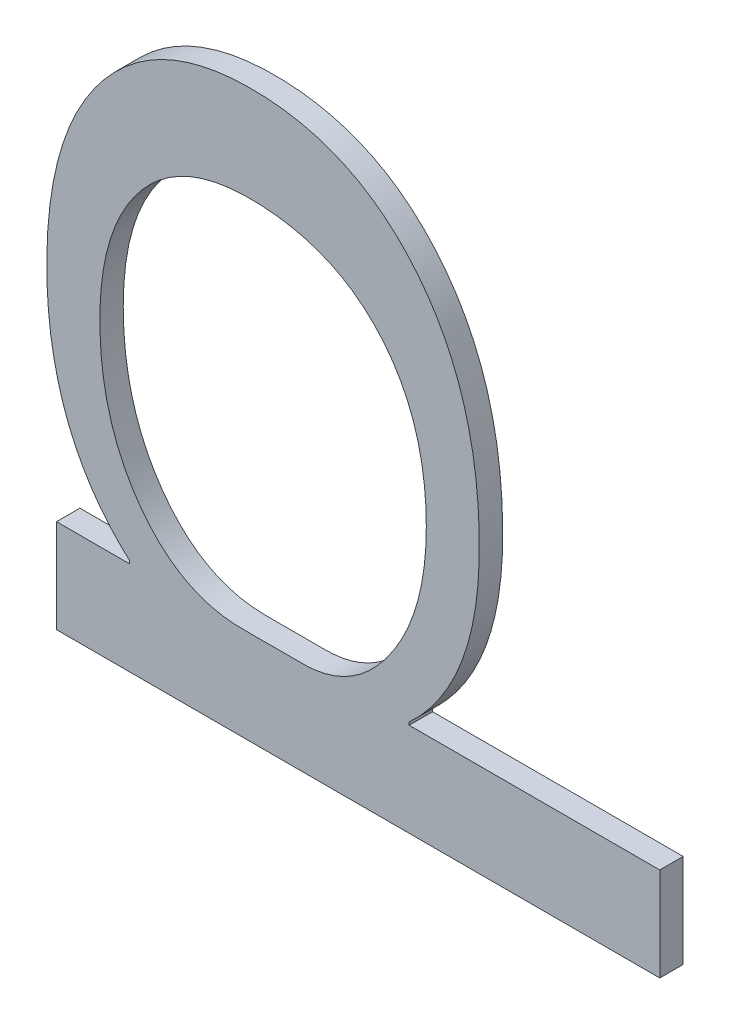
ISO-10303-21;
HEADER;
FILE_DESCRIPTION(('STEP AP214'),'2;1');
FILE_NAME('part.step','',(''),(''),'','','');
FILE_SCHEMA(('AUTOMOTIVE_DESIGN { 1 0 10303 214 1 1 1 1 }'));
ENDSEC;
DATA;
#1=APPLICATION_CONTEXT('core data for automotive mechanical design processes');
#2=APPLICATION_PROTOCOL_DEFINITION('international standard','automotive_design',2000,#1);
#3=PRODUCT_CONTEXT('',#1,'mechanical');
#4=PRODUCT('Part','Part','',(#3));
#5=PRODUCT_RELATED_PRODUCT_CATEGORY('part','',(#4));
#6=PRODUCT_DEFINITION_FORMATION('','',#4);
#7=PRODUCT_DEFINITION_CONTEXT('part definition',#1,'design');
#8=PRODUCT_DEFINITION('design','',#6,#7);
#9=PRODUCT_DEFINITION_SHAPE('','',#8);
#10=(LENGTH_UNIT() NAMED_UNIT(*) SI_UNIT(.MILLI.,.METRE.));
#11=(NAMED_UNIT(*) PLANE_ANGLE_UNIT() SI_UNIT($,.RADIAN.));
#12=(NAMED_UNIT(*) SI_UNIT($,.STERADIAN.) SOLID_ANGLE_UNIT());
#13=UNCERTAINTY_MEASURE_WITH_UNIT(LENGTH_MEASURE(1.E-05),#10,'distance_accuracy_value','');
#14=(GEOMETRIC_REPRESENTATION_CONTEXT(3) GLOBAL_UNCERTAINTY_ASSIGNED_CONTEXT((#13)) GLOBAL_UNIT_ASSIGNED_CONTEXT((#10,
#11,#12)) REPRESENTATION_CONTEXT('',''));
#15=CARTESIAN_POINT('',(0.,0.,0.));
#16=DIRECTION('',(0.,0.,1.));
#17=DIRECTION('',(1.,0.,0.));
#18=AXIS2_PLACEMENT_3D('',#15,#16,#17);
#19=CARTESIAN_POINT('',(-8.95983005625009,-22.7704584365744,333.160489148867));
#20=DIRECTION('',(0.,0.,1.));
#21=DIRECTION('',(1.,0.,0.));
#22=AXIS2_PLACEMENT_3D('',#19,#20,#21);
#23=PLANE('',#22);
#24=DIRECTION('',(1.,0.,0.));
#25=VECTOR('',#24,1.);
#26=CARTESIAN_POINT('',(2.66453525910038E-13,-70.4596635464495,333.160489148867));
#27=LINE('',#26,#25);
#28=CARTESIAN_POINT('',(-7.19032697632218,-70.4596635464495,333.160489148867));
#29=VERTEX_POINT('',#28);
#30=CARTESIAN_POINT('',(-3.97696685012026,-70.4596635464495,333.160489148867));
#31=VERTEX_POINT('',#30);
#32=EDGE_CURVE('E222',#29,#31,#27,.T.);
#33=ORIENTED_EDGE('',*,*,#32,.T.);
#34=DIRECTION('',(0.,-1.,0.));
#35=VECTOR('',#34,1.);
#36=CARTESIAN_POINT('',(-3.97696685012026,-50.9500000001419,333.160489148867));
#37=LINE('',#36,#35);
#38=CARTESIAN_POINT('',(-3.97696685012026,-71.6592860674831,333.160489148867));
#39=VERTEX_POINT('',#38);
#40=EDGE_CURVE('E55',#31,#39,#37,.T.);
#41=ORIENTED_EDGE('',*,*,#40,.T.);
#42=DIRECTION('',(-1.,0.,0.));
#43=VECTOR('',#42,1.);
#44=CARTESIAN_POINT('',(2.66453525910038E-13,-71.6592860674831,333.160489148867));
#45=LINE('',#44,#43);
#46=CARTESIAN_POINT('',(-11.7110601493991,-71.6592860674831,333.160489148867));
#47=VERTEX_POINT('',#46);
#48=EDGE_CURVE('E241',#39,#47,#45,.T.);
#49=ORIENTED_EDGE('',*,*,#48,.T.);
#50=DIRECTION('',(0.,1.,0.));
#51=VECTOR('',#50,1.);
#52=CARTESIAN_POINT('',(-11.7110601493991,-50.9500000001419,333.160489148867));
#53=LINE('',#52,#51);
#54=CARTESIAN_POINT('',(-11.7110601493991,-70.4596635464495,333.160489148867));
#55=VERTEX_POINT('',#54);
#56=EDGE_CURVE('E110',#47,#55,#53,.T.);
#57=ORIENTED_EDGE('',*,*,#56,.T.);
#58=DIRECTION('',(1.,0.,0.));
#59=VECTOR('',#58,1.);
#60=CARTESIAN_POINT('',(2.66453525910038E-13,-70.4596635464495,333.160489148867));
#61=LINE('',#60,#59);
#62=CARTESIAN_POINT('',(-10.7724333465145,-70.4596635464495,333.160489148867));
#63=VERTEX_POINT('',#62);
#64=EDGE_CURVE('E183',#55,#63,#61,.T.);
#65=ORIENTED_EDGE('',*,*,#64,.T.);
#66=DIRECTION('',(0.,1.,0.));
#67=VECTOR('',#66,1.);
#68=CARTESIAN_POINT('',(-10.7724333465145,-50.9500000001419,333.160489148867));
#69=LINE('',#68,#67);
#70=CARTESIAN_POINT('',(-10.7724333465145,-70.4237467045024,333.160489148867));
#71=VERTEX_POINT('',#70);
#72=EDGE_CURVE('E153',#63,#71,#69,.T.);
#73=ORIENTED_EDGE('',*,*,#72,.T.);
#74=CARTESIAN_POINT('',(-10.7724333465145,-70.4237467045024,333.160489148867));
#75=CARTESIAN_POINT('',(-11.4811923609376,-69.7963992920262,333.160489148867));
#76=CARTESIAN_POINT('',(-11.8355718681491,-68.8793225007764,333.160489148867));
#77=CARTESIAN_POINT('',(-11.8355718681491,-66.6620563116414,333.160489148867));
#78=CARTESIAN_POINT('',(-11.6001172669569,-65.8647020166082,333.160489148867));
#79=CARTESIAN_POINT('',(-10.6582974796157,-64.6962080161361,333.160489148867));
#80=CARTESIAN_POINT('',(-10.0205741217549,-64.4040834817653,333.160489148867));
#81=CARTESIAN_POINT('',(-8.33487700637026,-64.4040845553665,333.160489148867));
#82=CARTESIAN_POINT('',(-7.62691581837719,-64.7309279588011,333.160489148867));
#83=CARTESIAN_POINT('',(-6.55739215658717,-66.0383003027596,333.160489148867));
#84=CARTESIAN_POINT('',(-6.29001147151449,-66.9230522168573,333.160489148867));
#85=CARTESIAN_POINT('',(-6.29001147151449,-69.0732734472908,333.160489148867));
#86=CARTESIAN_POINT('',(-6.59011688920624,-69.8682329759204,333.160489148867));
#87=CARTESIAN_POINT('',(-7.19032697632218,-70.4237467045024,333.160489148867));
#88=(BOUNDED_CURVE() B_SPLINE_CURVE(3,(#74,#75,#76,#77,#78,#79,#80,#81,#82,#83,#84,#85,#86,#87),
.UNSPECIFIED.,.F.,.F.) B_SPLINE_CURVE_WITH_KNOTS((4,2,2,2,2,2,4),(0.,0.186607926762102,
0.342855021081848,0.49910207330936,0.670229816207461,0.841357743121363,1.),
.UNSPECIFIED.) CURVE() GEOMETRIC_REPRESENTATION_ITEM() RATIONAL_B_SPLINE_CURVE((1.,1.,1.,1.,1.,
1.,1.,1.,1.,1.,1.,1.,1.,1.)) REPRESENTATION_ITEM(''));
#89=CARTESIAN_POINT('',(-7.19032697632218,-70.4237467045024,333.160489148867));
#90=VERTEX_POINT('',#89);
#91=EDGE_CURVE('E11',#71,#90,#88,.T.);
#92=ORIENTED_EDGE('',*,*,#91,.T.);
#93=DIRECTION('',(0.,-1.,0.));
#94=VECTOR('',#93,1.);
#95=CARTESIAN_POINT('',(-7.19032697632218,-50.9500000001419,333.160489148867));
#96=LINE('',#95,#94);
#97=EDGE_CURVE('E152',#90,#29,#96,.T.);
#98=ORIENTED_EDGE('',*,*,#97,.T.);
#99=EDGE_LOOP('',(#33,#41,#49,#57,#65,#73,#92,#98));
#100=FACE_BOUND('',#99,.T.);
#101=CARTESIAN_POINT('',(-6.97003701237988,-68.1466189864366,333.160489148867));
#102=CARTESIAN_POINT('',(-6.97003701237988,-67.3660264138048,333.160489148867));
#103=CARTESIAN_POINT('',(-7.17117104828627,-66.751848165859,333.160489148867));
#104=CARTESIAN_POINT('',(-7.97570858689911,-65.856322011028,333.160489148867));
#105=CARTESIAN_POINT('',(-8.53122240901458,-65.6324393225189,333.160489148867));
#106=CARTESIAN_POINT('',(-9.8369990270917,-65.6324405499578,333.160489148867));
#107=CARTESIAN_POINT('',(-10.305515176333,-65.8431522510581,333.160489148867));
#108=CARTESIAN_POINT('',(-10.9855395679336,-66.6860010600063,333.160489148867));
#109=CARTESIAN_POINT('',(-11.1555466866488,-67.2463037943813,333.160489148867));
#110=CARTESIAN_POINT('',(-11.1555459531499,-68.6733994606798,333.160489148867));
#111=CARTESIAN_POINT('',(-10.9839434968293,-69.2744083017314,333.160489148867));
#112=CARTESIAN_POINT('',(-10.2975326313468,-70.2226123895985,333.160489148867));
#113=CARTESIAN_POINT('',(-9.85934715959198,-70.4596635464495,333.160489148867));
#114=CARTESIAN_POINT('',(-9.0707732214423,-70.4596635464495,333.160489148867));
#115=CARTESIAN_POINT('',(-8.81536459877397,-70.4596635464495,333.160489148867));
#116=CARTESIAN_POINT('',(-8.11618309709198,-70.4596635464495,333.160489148867));
#117=CARTESIAN_POINT('',(-7.74025361599626,-70.2369790355608,333.160489148867));
#118=CARTESIAN_POINT('',(-7.12408060615335,-69.3462417266892,333.160489148867));
#119=CARTESIAN_POINT('',(-6.97003701237988,-68.7979113664967,333.160489148867));
#120=CARTESIAN_POINT('',(-6.97003701237988,-68.1466189864366,333.160489148867));
#121=(BOUNDED_CURVE() B_SPLINE_CURVE(3,(#101,#102,#103,#104,#105,#106,#107,#108,#109,#110,#111,
#112,#113,#114,#115,#116,#117,#118,#119,#120),.UNSPECIFIED.,.T.,
.F.) B_SPLINE_CURVE_WITH_KNOTS((4,2,2,2,2,2,2,2,2,4),(0.,0.136638925353513,0.27327775593979,
0.388374412813432,0.503471205427693,0.623298083400434,0.743125097738412,0.800527280141993,
0.900263661321193,1.),
.UNSPECIFIED.) CURVE() GEOMETRIC_REPRESENTATION_ITEM() RATIONAL_B_SPLINE_CURVE((1.,1.,1.,1.,1.,
1.,1.,1.,1.,1.,1.,1.,1.,1.,1.,1.,1.,1.,1.,1.)) REPRESENTATION_ITEM(''));
#122=CARTESIAN_POINT('',(-6.97003701237988,-68.1466189864366,333.160489148867));
#123=VERTEX_POINT('',#122);
#124=EDGE_CURVE('E274',#123,#123,#121,.T.);
#125=ORIENTED_EDGE('',*,*,#124,.T.);
#126=EDGE_LOOP('',(#125));
#127=FACE_BOUND('',#126,.T.);
#128=ADVANCED_FACE('F42',(#100,#127),#23,.F.);
#129=CARTESIAN_POINT('',(-10.7724333465145,-70.4237467045024,332.960489148867));
#130=CARTESIAN_POINT('',(-11.4811923609376,-69.7963992920262,332.960489148867));
#131=CARTESIAN_POINT('',(-11.8355718681491,-68.8793225007764,332.960489148867));
#132=CARTESIAN_POINT('',(-11.8355718681491,-66.6620563116414,332.960489148867));
#133=CARTESIAN_POINT('',(-11.6001172669569,-65.8647020166082,332.960489148867));
#134=CARTESIAN_POINT('',(-10.6582974796157,-64.6962080161361,332.960489148867));
#135=CARTESIAN_POINT('',(-10.0205741217549,-64.4040834817653,332.960489148867));
#136=CARTESIAN_POINT('',(-8.33487700637026,-64.4040845553665,332.960489148867));
#137=CARTESIAN_POINT('',(-7.62691581837719,-64.7309279588011,332.960489148867));
#138=CARTESIAN_POINT('',(-6.55739215658717,-66.0383003027596,332.960489148867));
#139=CARTESIAN_POINT('',(-6.29001147151449,-66.9230522168573,332.960489148867));
#140=CARTESIAN_POINT('',(-6.29001147151449,-69.0732734472908,332.960489148867));
#141=CARTESIAN_POINT('',(-6.59011688920624,-69.8682329759204,332.960489148867));
#142=CARTESIAN_POINT('',(-7.19032697632218,-70.4237467045024,332.960489148867));
#143=(BOUNDED_CURVE() B_SPLINE_CURVE(3,(#129,#130,#131,#132,#133,#134,#135,#136,#137,#138,#139,
#140,#141,#142),.UNSPECIFIED.,.F.,.F.) B_SPLINE_CURVE_WITH_KNOTS((4,2,2,2,2,2,4),(0.,
0.186607926762102,0.342855021081848,0.49910207330936,0.670229816207461,0.841357743121363,1.),
.UNSPECIFIED.) CURVE() GEOMETRIC_REPRESENTATION_ITEM() RATIONAL_B_SPLINE_CURVE((1.,1.,1.,1.,1.,
1.,1.,1.,1.,1.,1.,1.,1.,1.)) REPRESENTATION_ITEM(''));
#144=DIRECTION('',(0.,0.,1.));
#145=VECTOR('',#144,1.);
#146=SURFACE_OF_LINEAR_EXTRUSION('',#143,#145);
#147=ORIENTED_EDGE('',*,*,#91,.F.);
#148=CARTESIAN_POINT('',(-10.7724333465145,-70.4237467045024,333.460489148867));
#149=CARTESIAN_POINT('',(-10.7724333465145,-70.4237467045024,333.360489148867));
#150=CARTESIAN_POINT('',(-10.7724333465145,-70.4237467045024,333.260489148867));
#151=CARTESIAN_POINT('',(-10.7724333465145,-70.4237467045024,333.160489148867));
#152=(BOUNDED_CURVE() B_SPLINE_CURVE(3,(#148,#149,#150,#151),.UNSPECIFIED.,.F.,
.F.) B_SPLINE_CURVE_WITH_KNOTS((4,4),(0.,1.),
.UNSPECIFIED.) CURVE() GEOMETRIC_REPRESENTATION_ITEM() RATIONAL_B_SPLINE_CURVE((1.,1.,1.,1.)) REPRESENTATION_ITEM(''));
#153=CARTESIAN_POINT('',(-10.7724333465145,-70.4237467045024,333.460489148867));
#154=VERTEX_POINT('',#153);
#155=EDGE_CURVE('E46',#154,#71,#152,.T.);
#156=ORIENTED_EDGE('',*,*,#155,.F.);
#157=CARTESIAN_POINT('',(-7.19032697632218,-70.4237467045024,333.460489148867));
#158=CARTESIAN_POINT('',(-6.59011688920624,-69.8682329759204,333.460489148867));
#159=CARTESIAN_POINT('',(-6.29001147151449,-69.0732734472908,333.460489148867));
#160=CARTESIAN_POINT('',(-6.29001147151449,-66.9230522168573,333.460489148867));
#161=CARTESIAN_POINT('',(-6.55739215658717,-66.0383003027596,333.460489148867));
#162=CARTESIAN_POINT('',(-7.62691581837719,-64.7309279588011,333.460489148867));
#163=CARTESIAN_POINT('',(-8.33487700637026,-64.4040845553665,333.460489148867));
#164=CARTESIAN_POINT('',(-10.0205741217549,-64.4040834817653,333.460489148867));
#165=CARTESIAN_POINT('',(-10.6582974796157,-64.6962080161361,333.460489148867));
#166=CARTESIAN_POINT('',(-11.6001172669569,-65.8647020166082,333.460489148867));
#167=CARTESIAN_POINT('',(-11.8355718681491,-66.6620563116414,333.460489148867));
#168=CARTESIAN_POINT('',(-11.8355718681491,-68.8793225007764,333.460489148867));
#169=CARTESIAN_POINT('',(-11.4811923609376,-69.7963992920262,333.460489148867));
#170=CARTESIAN_POINT('',(-10.7724333465145,-70.4237467045024,333.460489148867));
#171=(BOUNDED_CURVE() B_SPLINE_CURVE(3,(#157,#158,#159,#160,#161,#162,#163,#164,#165,#166,#167,
#168,#169,#170),.UNSPECIFIED.,.F.,.F.) B_SPLINE_CURVE_WITH_KNOTS((4,2,2,2,2,2,4),(0.,
0.158642256878637,0.329770183792539,0.50089792669064,0.657144978918152,0.813392073237898,1.),
.UNSPECIFIED.) CURVE() GEOMETRIC_REPRESENTATION_ITEM() RATIONAL_B_SPLINE_CURVE((1.,1.,1.,1.,1.,
1.,1.,1.,1.,1.,1.,1.,1.,1.)) REPRESENTATION_ITEM(''));
#172=CARTESIAN_POINT('',(-7.19032697632218,-70.4237467045024,333.460489148867));
#173=VERTEX_POINT('',#172);
#174=EDGE_CURVE('E147',#173,#154,#171,.T.);
#175=ORIENTED_EDGE('',*,*,#174,.F.);
#176=CARTESIAN_POINT('',(-7.19032697632218,-70.4237467045024,333.160489148867));
#177=CARTESIAN_POINT('',(-7.19032697632218,-70.4237467045024,333.260489148867));
#178=CARTESIAN_POINT('',(-7.19032697632218,-70.4237467045024,333.360489148867));
#179=CARTESIAN_POINT('',(-7.19032697632218,-70.4237467045024,333.460489148867));
#180=(BOUNDED_CURVE() B_SPLINE_CURVE(3,(#176,#177,#178,#179),.UNSPECIFIED.,.F.,
.F.) B_SPLINE_CURVE_WITH_KNOTS((4,4),(0.,1.),
.UNSPECIFIED.) CURVE() GEOMETRIC_REPRESENTATION_ITEM() RATIONAL_B_SPLINE_CURVE((1.,1.,1.,1.)) REPRESENTATION_ITEM(''));
#181=EDGE_CURVE('E203',#90,#173,#180,.T.);
#182=ORIENTED_EDGE('',*,*,#181,.F.);
#183=EDGE_LOOP('',(#147,#156,#175,#182));
#184=FACE_BOUND('',#183,.T.);
#185=ADVANCED_FACE('F144',(#184),#146,.F.);
#186=CARTESIAN_POINT('',(-3.97696685012026,-71.6592860674831,332.960489148867));
#187=DIRECTION('',(1.,0.,0.));
#188=DIRECTION('',(0.,1.,0.));
#189=AXIS2_PLACEMENT_3D('',#186,#187,#188);
#190=PLANE('',#189);
#191=ORIENTED_EDGE('',*,*,#40,.F.);
#192=CARTESIAN_POINT('',(-3.97696685012026,-70.4596635464495,333.160489148867));
#193=CARTESIAN_POINT('',(-3.97696685012026,-70.4596635464495,333.260489148867));
#194=CARTESIAN_POINT('',(-3.97696685012026,-70.4596635464495,333.360489148867));
#195=CARTESIAN_POINT('',(-3.97696685012026,-70.4596635464495,333.460489148867));
#196=(BOUNDED_CURVE() B_SPLINE_CURVE(3,(#192,#193,#194,#195),.UNSPECIFIED.,.F.,
.F.) B_SPLINE_CURVE_WITH_KNOTS((4,4),(0.,1.),
.UNSPECIFIED.) CURVE() GEOMETRIC_REPRESENTATION_ITEM() RATIONAL_B_SPLINE_CURVE((1.,1.,1.,1.)) REPRESENTATION_ITEM(''));
#197=CARTESIAN_POINT('',(-3.97696685012026,-70.4596635464495,333.460489148867));
#198=VERTEX_POINT('',#197);
#199=EDGE_CURVE('E247',#31,#198,#196,.T.);
#200=ORIENTED_EDGE('',*,*,#199,.T.);
#201=CARTESIAN_POINT('',(-3.97696685012026,-71.6592860674831,333.460489148867));
#202=CARTESIAN_POINT('',(-3.97696685012026,-71.2594118938053,333.460489148867));
#203=CARTESIAN_POINT('',(-3.97696685012026,-70.8595377201274,333.460489148867));
#204=CARTESIAN_POINT('',(-3.97696685012026,-70.4596635464495,333.460489148867));
#205=(BOUNDED_CURVE() B_SPLINE_CURVE(3,(#201,#202,#203,#204),.UNSPECIFIED.,.F.,
.F.) B_SPLINE_CURVE_WITH_KNOTS((4,4),(0.,1.),
.UNSPECIFIED.) CURVE() GEOMETRIC_REPRESENTATION_ITEM() RATIONAL_B_SPLINE_CURVE((1.,1.,1.,1.)) REPRESENTATION_ITEM(''));
#206=CARTESIAN_POINT('',(-3.97696685012026,-71.6592860674831,333.460489148867));
#207=VERTEX_POINT('',#206);
#208=EDGE_CURVE('E267',#207,#198,#205,.T.);
#209=ORIENTED_EDGE('',*,*,#208,.F.);
#210=CARTESIAN_POINT('',(-3.97696685012026,-71.6592860674831,333.160489148867));
#211=CARTESIAN_POINT('',(-3.97696685012026,-71.6592860674831,333.260489148867));
#212=CARTESIAN_POINT('',(-3.97696685012026,-71.6592860674831,333.360489148867));
#213=CARTESIAN_POINT('',(-3.97696685012026,-71.6592860674831,333.460489148867));
#214=(BOUNDED_CURVE() B_SPLINE_CURVE(3,(#210,#211,#212,#213),.UNSPECIFIED.,.F.,
.F.) B_SPLINE_CURVE_WITH_KNOTS((4,4),(0.,1.),
.UNSPECIFIED.) CURVE() GEOMETRIC_REPRESENTATION_ITEM() RATIONAL_B_SPLINE_CURVE((1.,1.,1.,1.)) REPRESENTATION_ITEM(''));
#215=EDGE_CURVE('E191',#39,#207,#214,.T.);
#216=ORIENTED_EDGE('',*,*,#215,.F.);
#217=EDGE_LOOP('',(#191,#200,#209,#216));
#218=FACE_BOUND('',#217,.T.);
#219=ADVANCED_FACE('F323',(#218),#190,.T.);
#220=CARTESIAN_POINT('',(-3.97696685012026,-70.4596635464495,332.960489148867));
#221=DIRECTION('',(0.,1.,0.));
#222=DIRECTION('',(1.,0.,0.));
#223=AXIS2_PLACEMENT_3D('',#220,#221,#222);
#224=PLANE('',#223);
#225=ORIENTED_EDGE('',*,*,#32,.F.);
#226=CARTESIAN_POINT('',(-7.19032697632218,-70.4596635464495,333.160489148867));
#227=CARTESIAN_POINT('',(-7.19032697632218,-70.4596635464495,333.260489148867));
#228=CARTESIAN_POINT('',(-7.19032697632218,-70.4596635464495,333.360489148867));
#229=CARTESIAN_POINT('',(-7.19032697632218,-70.4596635464495,333.460489148867));
#230=(BOUNDED_CURVE() B_SPLINE_CURVE(3,(#226,#227,#228,#229),.UNSPECIFIED.,.F.,
.F.) B_SPLINE_CURVE_WITH_KNOTS((4,4),(0.,1.),
.UNSPECIFIED.) CURVE() GEOMETRIC_REPRESENTATION_ITEM() RATIONAL_B_SPLINE_CURVE((1.,1.,1.,1.)) REPRESENTATION_ITEM(''));
#231=CARTESIAN_POINT('',(-7.19032697632218,-70.4596635464495,333.460489148867));
#232=VERTEX_POINT('',#231);
#233=EDGE_CURVE('E214',#29,#232,#230,.T.);
#234=ORIENTED_EDGE('',*,*,#233,.T.);
#235=CARTESIAN_POINT('',(-3.97696685012026,-70.4596635464495,333.460489148867));
#236=CARTESIAN_POINT('',(-5.04808689218757,-70.4596635464495,333.460489148867));
#237=CARTESIAN_POINT('',(-6.11920693425488,-70.4596635464495,333.460489148867));
#238=CARTESIAN_POINT('',(-7.19032697632218,-70.4596635464495,333.460489148867));
#239=(BOUNDED_CURVE() B_SPLINE_CURVE(3,(#235,#236,#237,#238),.UNSPECIFIED.,.F.,
.F.) B_SPLINE_CURVE_WITH_KNOTS((4,4),(0.,1.),
.UNSPECIFIED.) CURVE() GEOMETRIC_REPRESENTATION_ITEM() RATIONAL_B_SPLINE_CURVE((1.,1.,1.,1.)) REPRESENTATION_ITEM(''));
#240=EDGE_CURVE('E177',#198,#232,#239,.T.);
#241=ORIENTED_EDGE('',*,*,#240,.F.);
#242=ORIENTED_EDGE('',*,*,#199,.F.);
#243=EDGE_LOOP('',(#225,#234,#241,#242));
#244=FACE_BOUND('',#243,.T.);
#245=ADVANCED_FACE('F325',(#244),#224,.T.);
#246=CARTESIAN_POINT('',(-7.19032697632218,-70.4596635464495,332.960489148867));
#247=DIRECTION('',(1.,0.,0.));
#248=DIRECTION('',(0.,1.,0.));
#249=AXIS2_PLACEMENT_3D('',#246,#247,#248);
#250=PLANE('',#249);
#251=ORIENTED_EDGE('',*,*,#97,.F.);
#252=ORIENTED_EDGE('',*,*,#181,.T.);
#253=CARTESIAN_POINT('',(-7.19032697632218,-70.4596635464495,333.460489148867));
#254=CARTESIAN_POINT('',(-7.19032697632218,-70.4476912658004,333.460489148867));
#255=CARTESIAN_POINT('',(-7.19032697632218,-70.4357189851514,333.460489148867));
#256=CARTESIAN_POINT('',(-7.19032697632218,-70.4237467045024,333.460489148867));
#257=(BOUNDED_CURVE() B_SPLINE_CURVE(3,(#253,#254,#255,#256),.UNSPECIFIED.,.F.,
.F.) B_SPLINE_CURVE_WITH_KNOTS((4,4),(0.,1.),
.UNSPECIFIED.) CURVE() GEOMETRIC_REPRESENTATION_ITEM() RATIONAL_B_SPLINE_CURVE((1.,1.,1.,1.)) REPRESENTATION_ITEM(''));
#258=EDGE_CURVE('E170',#232,#173,#257,.T.);
#259=ORIENTED_EDGE('',*,*,#258,.F.);
#260=ORIENTED_EDGE('',*,*,#233,.F.);
#261=EDGE_LOOP('',(#251,#252,#259,#260));
#262=FACE_BOUND('',#261,.T.);
#263=ADVANCED_FACE('F329',(#262),#250,.T.);
#264=CARTESIAN_POINT('',(-10.7724333465145,-70.4237467045024,332.960489148867));
#265=DIRECTION('',(-1.,0.,0.));
#266=DIRECTION('',(0.,0.,1.));
#267=AXIS2_PLACEMENT_3D('',#264,#265,#266);
#268=PLANE('',#267);
#269=ORIENTED_EDGE('',*,*,#72,.F.);
#270=CARTESIAN_POINT('',(-10.7724333465145,-70.4596635464495,333.160489148867));
#271=CARTESIAN_POINT('',(-10.7724333465145,-70.4596635464495,333.260489148867));
#272=CARTESIAN_POINT('',(-10.7724333465145,-70.4596635464495,333.360489148867));
#273=CARTESIAN_POINT('',(-10.7724333465145,-70.4596635464495,333.460489148867));
#274=(BOUNDED_CURVE() B_SPLINE_CURVE(3,(#270,#271,#272,#273),.UNSPECIFIED.,.F.,
.F.) B_SPLINE_CURVE_WITH_KNOTS((4,4),(0.,1.),
.UNSPECIFIED.) CURVE() GEOMETRIC_REPRESENTATION_ITEM() RATIONAL_B_SPLINE_CURVE((1.,1.,1.,1.)) REPRESENTATION_ITEM(''));
#275=CARTESIAN_POINT('',(-10.7724333465145,-70.4596635464495,333.460489148867));
#276=VERTEX_POINT('',#275);
#277=EDGE_CURVE('E158',#63,#276,#274,.T.);
#278=ORIENTED_EDGE('',*,*,#277,.T.);
#279=CARTESIAN_POINT('',(-10.7724333465145,-70.4237467045024,333.460489148867));
#280=CARTESIAN_POINT('',(-10.7724333465145,-70.4357189851514,333.460489148867));
#281=CARTESIAN_POINT('',(-10.7724333465145,-70.4476912658004,333.460489148867));
#282=CARTESIAN_POINT('',(-10.7724333465145,-70.4596635464495,333.460489148867));
#283=(BOUNDED_CURVE() B_SPLINE_CURVE(3,(#279,#280,#281,#282),.UNSPECIFIED.,.F.,
.F.) B_SPLINE_CURVE_WITH_KNOTS((4,4),(0.,1.),
.UNSPECIFIED.) CURVE() GEOMETRIC_REPRESENTATION_ITEM() RATIONAL_B_SPLINE_CURVE((1.,1.,1.,1.)) REPRESENTATION_ITEM(''));
#284=EDGE_CURVE('E155',#154,#276,#283,.T.);
#285=ORIENTED_EDGE('',*,*,#284,.F.);
#286=ORIENTED_EDGE('',*,*,#155,.T.);
#287=EDGE_LOOP('',(#269,#278,#285,#286));
#288=FACE_BOUND('',#287,.T.);
#289=ADVANCED_FACE('F156',(#288),#268,.T.);
#290=CARTESIAN_POINT('',(-10.7724333465145,-70.4596635464495,332.960489148867));
#291=DIRECTION('',(0.,1.,0.));
#292=DIRECTION('',(1.,0.,0.));
#293=AXIS2_PLACEMENT_3D('',#290,#291,#292);
#294=PLANE('',#293);
#295=ORIENTED_EDGE('',*,*,#64,.F.);
#296=CARTESIAN_POINT('',(-11.7110601493991,-70.4596635464495,333.160489148867));
#297=CARTESIAN_POINT('',(-11.7110601493991,-70.4596635464495,333.260489148867));
#298=CARTESIAN_POINT('',(-11.7110601493991,-70.4596635464495,333.360489148867));
#299=CARTESIAN_POINT('',(-11.7110601493991,-70.4596635464495,333.460489148867));
#300=(BOUNDED_CURVE() B_SPLINE_CURVE(3,(#296,#297,#298,#299),.UNSPECIFIED.,.F.,
.F.) B_SPLINE_CURVE_WITH_KNOTS((4,4),(0.,1.),
.UNSPECIFIED.) CURVE() GEOMETRIC_REPRESENTATION_ITEM() RATIONAL_B_SPLINE_CURVE((1.,1.,1.,1.)) REPRESENTATION_ITEM(''));
#301=CARTESIAN_POINT('',(-11.7110601493991,-70.4596635464495,333.460489148867));
#302=VERTEX_POINT('',#301);
#303=EDGE_CURVE('E254',#55,#302,#300,.T.);
#304=ORIENTED_EDGE('',*,*,#303,.T.);
#305=CARTESIAN_POINT('',(-10.7724333465145,-70.4596635464495,333.460489148867));
#306=CARTESIAN_POINT('',(-11.085308947476,-70.4596635464495,333.460489148867));
#307=CARTESIAN_POINT('',(-11.3981845484376,-70.4596635464495,333.460489148867));
#308=CARTESIAN_POINT('',(-11.7110601493991,-70.4596635464495,333.460489148867));
#309=(BOUNDED_CURVE() B_SPLINE_CURVE(3,(#305,#306,#307,#308),.UNSPECIFIED.,.F.,
.F.) B_SPLINE_CURVE_WITH_KNOTS((4,4),(0.,1.),
.UNSPECIFIED.) CURVE() GEOMETRIC_REPRESENTATION_ITEM() RATIONAL_B_SPLINE_CURVE((1.,1.,1.,1.)) REPRESENTATION_ITEM(''));
#310=EDGE_CURVE('E163',#276,#302,#309,.T.);
#311=ORIENTED_EDGE('',*,*,#310,.F.);
#312=ORIENTED_EDGE('',*,*,#277,.F.);
#313=EDGE_LOOP('',(#295,#304,#311,#312));
#314=FACE_BOUND('',#313,.T.);
#315=ADVANCED_FACE('F333',(#314),#294,.T.);
#316=CARTESIAN_POINT('',(-11.7110601493991,-70.4596635464495,332.960489148867));
#317=DIRECTION('',(-1.,0.,0.));
#318=DIRECTION('',(0.,0.,1.));
#319=AXIS2_PLACEMENT_3D('',#316,#317,#318);
#320=PLANE('',#319);
#321=ORIENTED_EDGE('',*,*,#56,.F.);
#322=CARTESIAN_POINT('',(-11.7110601493991,-71.6592860674831,333.160489148867));
#323=CARTESIAN_POINT('',(-11.7110601493991,-71.6592860674831,333.260489148867));
#324=CARTESIAN_POINT('',(-11.7110601493991,-71.6592860674831,333.360489148867));
#325=CARTESIAN_POINT('',(-11.7110601493991,-71.6592860674831,333.460489148867));
#326=(BOUNDED_CURVE() B_SPLINE_CURVE(3,(#322,#323,#324,#325),.UNSPECIFIED.,.F.,
.F.) B_SPLINE_CURVE_WITH_KNOTS((4,4),(0.,1.),
.UNSPECIFIED.) CURVE() GEOMETRIC_REPRESENTATION_ITEM() RATIONAL_B_SPLINE_CURVE((1.,1.,1.,1.)) REPRESENTATION_ITEM(''));
#327=CARTESIAN_POINT('',(-11.7110601493991,-71.6592860674831,333.460489148867));
#328=VERTEX_POINT('',#327);
#329=EDGE_CURVE('E185',#47,#328,#326,.T.);
#330=ORIENTED_EDGE('',*,*,#329,.T.);
#331=CARTESIAN_POINT('',(-11.7110601493991,-70.4596635464495,333.460489148867));
#332=CARTESIAN_POINT('',(-11.7110601493991,-70.8595377201274,333.460489148867));
#333=CARTESIAN_POINT('',(-11.7110601493991,-71.2594118938053,333.460489148867));
#334=CARTESIAN_POINT('',(-11.7110601493991,-71.6592860674831,333.460489148867));
#335=(BOUNDED_CURVE() B_SPLINE_CURVE(3,(#331,#332,#333,#334),.UNSPECIFIED.,.F.,
.F.) B_SPLINE_CURVE_WITH_KNOTS((4,4),(0.,1.),
.UNSPECIFIED.) CURVE() GEOMETRIC_REPRESENTATION_ITEM() RATIONAL_B_SPLINE_CURVE((1.,1.,1.,1.)) REPRESENTATION_ITEM(''));
#336=EDGE_CURVE('E223',#302,#328,#335,.T.);
#337=ORIENTED_EDGE('',*,*,#336,.F.);
#338=ORIENTED_EDGE('',*,*,#303,.F.);
#339=EDGE_LOOP('',(#321,#330,#337,#338));
#340=FACE_BOUND('',#339,.T.);
#341=ADVANCED_FACE('F336',(#340),#320,.T.);
#342=CARTESIAN_POINT('',(-11.7110601493991,-71.6592860674831,332.960489148867));
#343=DIRECTION('',(0.,-1.,0.));
#344=DIRECTION('',(0.,0.,-1.));
#345=AXIS2_PLACEMENT_3D('',#342,#343,#344);
#346=PLANE('',#345);
#347=ORIENTED_EDGE('',*,*,#48,.F.);
#348=ORIENTED_EDGE('',*,*,#215,.T.);
#349=CARTESIAN_POINT('',(-11.7110601493991,-71.6592860674831,333.460489148867));
#350=CARTESIAN_POINT('',(-9.13302904963949,-71.6592860674831,333.460489148867));
#351=CARTESIAN_POINT('',(-6.55499794987988,-71.6592860674831,333.460489148867));
#352=CARTESIAN_POINT('',(-3.97696685012026,-71.6592860674831,333.460489148867));
#353=(BOUNDED_CURVE() B_SPLINE_CURVE(3,(#349,#350,#351,#352),.UNSPECIFIED.,.F.,
.F.) B_SPLINE_CURVE_WITH_KNOTS((4,4),(0.,1.),
.UNSPECIFIED.) CURVE() GEOMETRIC_REPRESENTATION_ITEM() RATIONAL_B_SPLINE_CURVE((1.,1.,1.,1.)) REPRESENTATION_ITEM(''));
#354=EDGE_CURVE('E232',#328,#207,#353,.T.);
#355=ORIENTED_EDGE('',*,*,#354,.F.);
#356=ORIENTED_EDGE('',*,*,#329,.F.);
#357=EDGE_LOOP('',(#347,#348,#355,#356));
#358=FACE_BOUND('',#357,.T.);
#359=ADVANCED_FACE('F44',(#358),#346,.T.);
#360=CARTESIAN_POINT('',(-9.20218057646048,-64.4041109991074,333.460489148867));
#361=DIRECTION('',(0.,0.,-1.));
#362=DIRECTION('',(0.,-1.,0.));
#363=AXIS2_PLACEMENT_3D('',#360,#361,#362);
#364=PLANE('',#363);
#365=ORIENTED_EDGE('',*,*,#208,.T.);
#366=ORIENTED_EDGE('',*,*,#240,.T.);
#367=ORIENTED_EDGE('',*,*,#258,.T.);
#368=ORIENTED_EDGE('',*,*,#174,.T.);
#369=ORIENTED_EDGE('',*,*,#284,.T.);
#370=ORIENTED_EDGE('',*,*,#310,.T.);
#371=ORIENTED_EDGE('',*,*,#336,.T.);
#372=ORIENTED_EDGE('',*,*,#354,.T.);
#373=EDGE_LOOP('',(#365,#366,#367,#368,#369,#370,#371,#372));
#374=FACE_BOUND('',#373,.T.);
#375=CARTESIAN_POINT('',(-6.97003701237988,-68.1466189864366,333.460489148867));
#376=CARTESIAN_POINT('',(-6.97003701237988,-68.7979113664967,333.460489148867));
#377=CARTESIAN_POINT('',(-7.12408060615335,-69.3462417266892,333.460489148867));
#378=CARTESIAN_POINT('',(-7.74025361599626,-70.2369790355608,333.460489148867));
#379=CARTESIAN_POINT('',(-8.11618309709198,-70.4596635464495,333.460489148867));
#380=CARTESIAN_POINT('',(-8.81536459877397,-70.4596635464495,333.460489148867));
#381=CARTESIAN_POINT('',(-9.0707732214423,-70.4596635464495,333.460489148867));
#382=CARTESIAN_POINT('',(-9.85934715959198,-70.4596635464495,333.460489148867));
#383=CARTESIAN_POINT('',(-10.2975326313468,-70.2226123895985,333.460489148867));
#384=CARTESIAN_POINT('',(-10.9839434968293,-69.2744083017314,333.460489148867));
#385=CARTESIAN_POINT('',(-11.1555459531499,-68.6733994606798,333.460489148867));
#386=CARTESIAN_POINT('',(-11.1555466866488,-67.2463037943813,333.460489148867));
#387=CARTESIAN_POINT('',(-10.9855395679336,-66.6860010600063,333.460489148867));
#388=CARTESIAN_POINT('',(-10.305515176333,-65.8431522510581,333.460489148867));
#389=CARTESIAN_POINT('',(-9.8369990270917,-65.6324405499578,333.460489148867));
#390=CARTESIAN_POINT('',(-8.53122240901458,-65.6324393225189,333.460489148867));
#391=CARTESIAN_POINT('',(-7.97570858689911,-65.856322011028,333.460489148867));
#392=CARTESIAN_POINT('',(-7.17117104828627,-66.751848165859,333.460489148867));
#393=CARTESIAN_POINT('',(-6.97003701237988,-67.3660264138048,333.460489148867));
#394=CARTESIAN_POINT('',(-6.97003701237988,-68.1466189864366,333.460489148867));
#395=(BOUNDED_CURVE() B_SPLINE_CURVE(3,(#375,#376,#377,#378,#379,#380,#381,#382,#383,#384,#385,
#386,#387,#388,#389,#390,#391,#392,#393,#394),.UNSPECIFIED.,.T.,
.F.) B_SPLINE_CURVE_WITH_KNOTS((4,2,2,2,2,2,2,2,2,4),(0.,0.099736338678807,0.199472719858007,
0.256874902261588,0.376701916599566,0.496528794572307,0.611625587186568,0.72672224406021,
0.863361074646487,1.),
.UNSPECIFIED.) CURVE() GEOMETRIC_REPRESENTATION_ITEM() RATIONAL_B_SPLINE_CURVE((1.,1.,1.,1.,1.,
1.,1.,1.,1.,1.,1.,1.,1.,1.,1.,1.,1.,1.,1.,1.)) REPRESENTATION_ITEM(''));
#396=CARTESIAN_POINT('',(-6.97003701237988,-68.1466189864366,333.460489148867));
#397=VERTEX_POINT('',#396);
#398=EDGE_CURVE('E281',#397,#397,#395,.T.);
#399=ORIENTED_EDGE('',*,*,#398,.T.);
#400=EDGE_LOOP('',(#399));
#401=FACE_BOUND('',#400,.T.);
#402=ADVANCED_FACE('F166',(#374,#401),#364,.F.);
#403=CARTESIAN_POINT('',(-6.97003701237988,-68.1466189864366,332.960489148867));
#404=CARTESIAN_POINT('',(-6.97003701237988,-67.3660264138048,332.960489148867));
#405=CARTESIAN_POINT('',(-7.17117104828627,-66.751848165859,332.960489148867));
#406=CARTESIAN_POINT('',(-7.97570858689911,-65.856322011028,332.960489148867));
#407=CARTESIAN_POINT('',(-8.53122240901458,-65.6324393225189,332.960489148867));
#408=CARTESIAN_POINT('',(-9.8369990270917,-65.6324405499578,332.960489148867));
#409=CARTESIAN_POINT('',(-10.305515176333,-65.8431522510581,332.960489148867));
#410=CARTESIAN_POINT('',(-10.9855395679336,-66.6860010600063,332.960489148867));
#411=CARTESIAN_POINT('',(-11.1555466866488,-67.2463037943813,332.960489148867));
#412=CARTESIAN_POINT('',(-11.1555459531499,-68.6733994606798,332.960489148867));
#413=CARTESIAN_POINT('',(-10.9839434968293,-69.2744083017314,332.960489148867));
#414=CARTESIAN_POINT('',(-10.2975326313468,-70.2226123895985,332.960489148867));
#415=CARTESIAN_POINT('',(-9.85934715959198,-70.4596635464495,332.960489148867));
#416=CARTESIAN_POINT('',(-9.0707732214423,-70.4596635464495,332.960489148867));
#417=CARTESIAN_POINT('',(-8.81536459877397,-70.4596635464495,332.960489148867));
#418=CARTESIAN_POINT('',(-8.11618309709198,-70.4596635464495,332.960489148867));
#419=CARTESIAN_POINT('',(-7.74025361599626,-70.2369790355608,332.960489148867));
#420=CARTESIAN_POINT('',(-7.12408060615335,-69.3462417266892,332.960489148867));
#421=CARTESIAN_POINT('',(-6.97003701237988,-68.7979113664967,332.960489148867));
#422=CARTESIAN_POINT('',(-6.97003701237988,-68.1466189864366,332.960489148867));
#423=(BOUNDED_CURVE() B_SPLINE_CURVE(3,(#403,#404,#405,#406,#407,#408,#409,#410,#411,#412,#413,
#414,#415,#416,#417,#418,#419,#420,#421,#422),.UNSPECIFIED.,.T.,
.F.) B_SPLINE_CURVE_WITH_KNOTS((4,2,2,2,2,2,2,2,2,4),(0.,0.136638925353513,0.27327775593979,
0.388374412813432,0.503471205427693,0.623298083400434,0.743125097738412,0.800527280141993,
0.900263661321193,1.),
.UNSPECIFIED.) CURVE() GEOMETRIC_REPRESENTATION_ITEM() RATIONAL_B_SPLINE_CURVE((1.,1.,1.,1.,1.,
1.,1.,1.,1.,1.,1.,1.,1.,1.,1.,1.,1.,1.,1.,1.)) REPRESENTATION_ITEM(''));
#424=DIRECTION('',(0.,0.,1.));
#425=VECTOR('',#424,1.);
#426=SURFACE_OF_LINEAR_EXTRUSION('',#423,#425);
#427=ORIENTED_EDGE('',*,*,#124,.F.);
#428=EDGE_LOOP('',(#427));
#429=FACE_BOUND('',#428,.T.);
#430=ORIENTED_EDGE('',*,*,#398,.F.);
#431=EDGE_LOOP('',(#430));
#432=FACE_BOUND('',#431,.T.);
#433=ADVANCED_FACE('F364',(#429,#432),#426,.F.);
#434=CLOSED_SHELL('',(#128,#185,#219,#245,#263,#289,#315,#341,#359,#402,#433));
#435=MANIFOLD_SOLID_BREP('B2',#434);
#436=ADVANCED_BREP_SHAPE_REPRESENTATION('',(#18,#435),#14);
#437=SHAPE_DEFINITION_REPRESENTATION(#9,#436);
ENDSEC;
END-ISO-10303-21;
